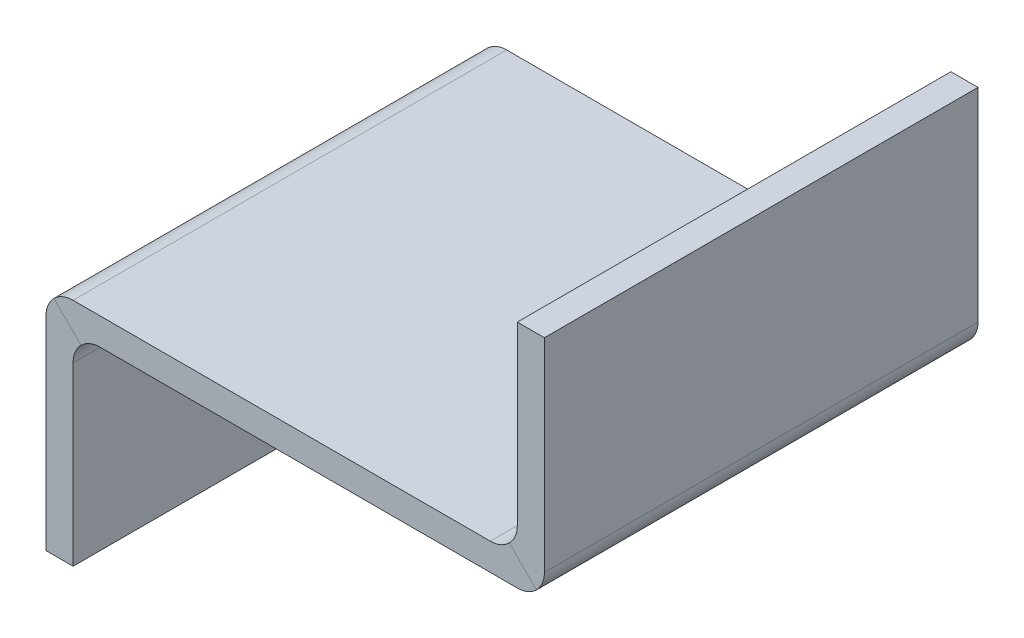
ISO-10303-21;
HEADER;
FILE_DESCRIPTION(('STEP AP214'),'2;1');
FILE_NAME('part.step','',(''),(''),'','','');
FILE_SCHEMA(('AUTOMOTIVE_DESIGN { 1 0 10303 214 1 1 1 1 }'));
ENDSEC;
DATA;
#1=APPLICATION_CONTEXT('core data for automotive mechanical design processes');
#2=APPLICATION_PROTOCOL_DEFINITION('international standard','automotive_design',2000,#1);
#3=PRODUCT_CONTEXT('',#1,'mechanical');
#4=PRODUCT('Part','Part','',(#3));
#5=PRODUCT_RELATED_PRODUCT_CATEGORY('part','',(#4));
#6=PRODUCT_DEFINITION_FORMATION('','',#4);
#7=PRODUCT_DEFINITION_CONTEXT('part definition',#1,'design');
#8=PRODUCT_DEFINITION('design','',#6,#7);
#9=PRODUCT_DEFINITION_SHAPE('','',#8);
#10=(LENGTH_UNIT() NAMED_UNIT(*) SI_UNIT(.MILLI.,.METRE.));
#11=(NAMED_UNIT(*) PLANE_ANGLE_UNIT() SI_UNIT($,.RADIAN.));
#12=(NAMED_UNIT(*) SI_UNIT($,.STERADIAN.) SOLID_ANGLE_UNIT());
#13=UNCERTAINTY_MEASURE_WITH_UNIT(LENGTH_MEASURE(1.E-05),#10,'distance_accuracy_value','');
#14=(GEOMETRIC_REPRESENTATION_CONTEXT(3) GLOBAL_UNCERTAINTY_ASSIGNED_CONTEXT((#13)) GLOBAL_UNIT_ASSIGNED_CONTEXT((#10,
#11,#12)) REPRESENTATION_CONTEXT('',''));
#15=CARTESIAN_POINT('',(0.,0.,0.));
#16=DIRECTION('',(0.,0.,1.));
#17=DIRECTION('',(1.,0.,0.));
#18=AXIS2_PLACEMENT_3D('',#15,#16,#17);
#19=CARTESIAN_POINT('',(21.74,20.,0.));
#20=DIRECTION('',(0.,-1.,0.));
#21=DIRECTION('',(0.,0.,1.));
#22=AXIS2_PLACEMENT_3D('',#19,#20,#21);
#23=PLANE('',#22);
#24=DIRECTION('',(-1.,0.,0.));
#25=VECTOR('',#24,1.);
#26=CARTESIAN_POINT('',(22.99,20.,-20.0000000000008));
#27=LINE('',#26,#25);
#28=CARTESIAN_POINT('',(22.99,20.,-20.0000000000008));
#29=VERTEX_POINT('',#28);
#30=CARTESIAN_POINT('',(20.49,20.,-20.0000000000008));
#31=VERTEX_POINT('',#30);
#32=EDGE_CURVE('E229',#29,#31,#27,.T.);
#33=ORIENTED_EDGE('',*,*,#32,.T.);
#34=DIRECTION('',(0.,0.,1.));
#35=VECTOR('',#34,1.);
#36=CARTESIAN_POINT('',(20.49,20.,20.));
#37=LINE('',#36,#35);
#38=CARTESIAN_POINT('',(20.49,20.,20.));
#39=VERTEX_POINT('',#38);
#40=EDGE_CURVE('E225',#31,#39,#37,.T.);
#41=ORIENTED_EDGE('',*,*,#40,.T.);
#42=DIRECTION('',(1.,0.,0.));
#43=VECTOR('',#42,1.);
#44=CARTESIAN_POINT('',(22.99,20.,20.));
#45=LINE('',#44,#43);
#46=CARTESIAN_POINT('',(22.99,20.,20.));
#47=VERTEX_POINT('',#46);
#48=EDGE_CURVE('E221',#39,#47,#45,.T.);
#49=ORIENTED_EDGE('',*,*,#48,.T.);
#50=DIRECTION('',(0.,0.,-1.));
#51=VECTOR('',#50,1.);
#52=CARTESIAN_POINT('',(22.99,20.,20.));
#53=LINE('',#52,#51);
#54=EDGE_CURVE('E217',#47,#29,#53,.T.);
#55=ORIENTED_EDGE('',*,*,#54,.T.);
#56=EDGE_LOOP('',(#33,#41,#49,#55));
#57=FACE_BOUND('',#56,.T.);
#58=ADVANCED_FACE('F39',(#57),#23,.F.);
#59=CARTESIAN_POINT('',(-21.74,-20.,0.));
#60=DIRECTION('',(0.,-1.,0.));
#61=DIRECTION('',(0.,0.,1.));
#62=AXIS2_PLACEMENT_3D('',#59,#60,#61);
#63=PLANE('',#62);
#64=DIRECTION('',(-1.,0.,0.));
#65=VECTOR('',#64,1.);
#66=CARTESIAN_POINT('',(-20.49,-20.,-20.0000000000008));
#67=LINE('',#66,#65);
#68=CARTESIAN_POINT('',(-20.49,-20.,-20.0000000000008));
#69=VERTEX_POINT('',#68);
#70=CARTESIAN_POINT('',(-22.99,-20.,-20.0000000000008));
#71=VERTEX_POINT('',#70);
#72=EDGE_CURVE('E151',#69,#71,#67,.T.);
#73=ORIENTED_EDGE('',*,*,#72,.F.);
#74=DIRECTION('',(0.,0.,-1.));
#75=VECTOR('',#74,1.);
#76=CARTESIAN_POINT('',(-20.49,-20.,20.));
#77=LINE('',#76,#75);
#78=CARTESIAN_POINT('',(-20.49,-20.,20.));
#79=VERTEX_POINT('',#78);
#80=EDGE_CURVE('E154',#79,#69,#77,.T.);
#81=ORIENTED_EDGE('',*,*,#80,.F.);
#82=DIRECTION('',(1.,0.,0.));
#83=VECTOR('',#82,1.);
#84=CARTESIAN_POINT('',(-20.49,-20.,20.));
#85=LINE('',#84,#83);
#86=CARTESIAN_POINT('',(-22.99,-20.,20.));
#87=VERTEX_POINT('',#86);
#88=EDGE_CURVE('E174',#87,#79,#85,.T.);
#89=ORIENTED_EDGE('',*,*,#88,.F.);
#90=DIRECTION('',(0.,0.,1.));
#91=VECTOR('',#90,1.);
#92=CARTESIAN_POINT('',(-22.99,-20.,20.));
#93=LINE('',#92,#91);
#94=EDGE_CURVE('E157',#71,#87,#93,.T.);
#95=ORIENTED_EDGE('',*,*,#94,.F.);
#96=EDGE_LOOP('',(#73,#81,#89,#95));
#97=FACE_BOUND('',#96,.T.);
#98=ADVANCED_FACE('F153',(#97),#63,.T.);
#99=CARTESIAN_POINT('',(22.99,-1.47500000000004,-20.0000000000008));
#100=DIRECTION('',(0.,0.,-1.));
#101=DIRECTION('',(-1.,0.,0.));
#102=AXIS2_PLACEMENT_3D('',#99,#100,#101);
#103=PLANE('',#102);
#104=DIRECTION('',(0.,1.,0.));
#105=VECTOR('',#104,1.);
#106=CARTESIAN_POINT('',(22.99,-1.47500000000004,-20.0000000000008));
#107=LINE('',#106,#105);
#108=CARTESIAN_POINT('',(22.99,1.25000000000003,-20.0000000000008));
#109=VERTEX_POINT('',#108);
#110=EDGE_CURVE('E203',#109,#29,#107,.T.);
#111=ORIENTED_EDGE('',*,*,#110,.F.);
#112=CARTESIAN_POINT('',(20.49,1.25000000000003,-20.0000000000008));
#113=DIRECTION('',(0.,0.,-1.));
#114=DIRECTION('',(-1.,0.,0.));
#115=AXIS2_PLACEMENT_3D('',#112,#113,#114);
#116=CIRCLE('',#115,2.5);
#117=CARTESIAN_POINT('',(22.2577669529664,-0.517766952966372,-20.0000000000008));
#118=VERTEX_POINT('',#117);
#119=EDGE_CURVE('E276',#109,#118,#116,.T.);
#120=ORIENTED_EDGE('',*,*,#119,.T.);
#121=DIRECTION('',(0.707106781186547,-0.707106781186548,0.));
#122=VECTOR('',#121,1.);
#123=CARTESIAN_POINT('',(-0.112499999999981,21.8525,-20.0000000000008));
#124=LINE('',#123,#122);
#125=CARTESIAN_POINT('',(19.7577669529663,1.98223304703368,-20.0000000000008));
#126=VERTEX_POINT('',#125);
#127=EDGE_CURVE('E198',#126,#118,#124,.T.);
#128=ORIENTED_EDGE('',*,*,#127,.F.);
#129=CARTESIAN_POINT('',(17.99,3.75000000000007,-20.0000000000008));
#130=DIRECTION('',(0.,0.,-1.));
#131=DIRECTION('',(-1.,0.,0.));
#132=AXIS2_PLACEMENT_3D('',#129,#130,#131);
#133=CIRCLE('',#132,2.5);
#134=CARTESIAN_POINT('',(20.49,3.75000000000007,-20.0000000000008));
#135=VERTEX_POINT('',#134);
#136=EDGE_CURVE('E300',#126,#135,#133,.F.);
#137=ORIENTED_EDGE('',*,*,#136,.T.);
#138=DIRECTION('',(0.,1.,0.));
#139=VECTOR('',#138,1.);
#140=CARTESIAN_POINT('',(20.49,-1.47500000000004,-20.0000000000008));
#141=LINE('',#140,#139);
#142=EDGE_CURVE('E239',#135,#31,#141,.T.);
#143=ORIENTED_EDGE('',*,*,#142,.T.);
#144=ORIENTED_EDGE('',*,*,#32,.F.);
#145=EDGE_LOOP('',(#111,#120,#128,#137,#143,#144));
#146=FACE_BOUND('',#145,.T.);
#147=ADVANCED_FACE('F369',(#146),#103,.T.);
#148=CARTESIAN_POINT('',(20.49,-1.47500000000004,20.));
#149=DIRECTION('',(-1.,0.,0.));
#150=DIRECTION('',(0.,-1.,0.));
#151=AXIS2_PLACEMENT_3D('',#148,#149,#150);
#152=PLANE('',#151);
#153=ORIENTED_EDGE('',*,*,#142,.F.);
#154=DIRECTION('',(0.,0.,-1.));
#155=VECTOR('',#154,1.);
#156=CARTESIAN_POINT('',(20.49,3.75000000000007,20.));
#157=LINE('',#156,#155);
#158=CARTESIAN_POINT('',(20.49,3.75000000000007,20.));
#159=VERTEX_POINT('',#158);
#160=EDGE_CURVE('E287',#135,#159,#157,.F.);
#161=ORIENTED_EDGE('',*,*,#160,.T.);
#162=DIRECTION('',(0.,1.,0.));
#163=VECTOR('',#162,1.);
#164=CARTESIAN_POINT('',(20.49,-1.47500000000004,20.));
#165=LINE('',#164,#163);
#166=EDGE_CURVE('E236',#159,#39,#165,.T.);
#167=ORIENTED_EDGE('',*,*,#166,.T.);
#168=ORIENTED_EDGE('',*,*,#40,.F.);
#169=EDGE_LOOP('',(#153,#161,#167,#168));
#170=FACE_BOUND('',#169,.T.);
#171=ADVANCED_FACE('F375',(#170),#152,.T.);
#172=CARTESIAN_POINT('',(22.99,-1.47500000000004,20.));
#173=DIRECTION('',(0.,0.,1.));
#174=DIRECTION('',(1.,0.,0.));
#175=AXIS2_PLACEMENT_3D('',#172,#173,#174);
#176=PLANE('',#175);
#177=DIRECTION('',(-0.707106781186547,0.707106781186548,0.));
#178=VECTOR('',#177,1.);
#179=CARTESIAN_POINT('',(-0.112499999999981,21.8525,20.));
#180=LINE('',#179,#178);
#181=CARTESIAN_POINT('',(22.2577669529664,-0.517766952966372,20.));
#182=VERTEX_POINT('',#181);
#183=CARTESIAN_POINT('',(19.7577669529663,1.98223304703368,20.));
#184=VERTEX_POINT('',#183);
#185=EDGE_CURVE('E162',#182,#184,#180,.T.);
#186=ORIENTED_EDGE('',*,*,#185,.F.);
#187=CARTESIAN_POINT('',(20.49,1.25000000000003,20.));
#188=DIRECTION('',(0.,0.,1.));
#189=DIRECTION('',(1.,0.,0.));
#190=AXIS2_PLACEMENT_3D('',#187,#188,#189);
#191=CIRCLE('',#190,2.5);
#192=CARTESIAN_POINT('',(22.99,1.25000000000003,20.));
#193=VERTEX_POINT('',#192);
#194=EDGE_CURVE('E270',#182,#193,#191,.T.);
#195=ORIENTED_EDGE('',*,*,#194,.T.);
#196=DIRECTION('',(0.,1.,0.));
#197=VECTOR('',#196,1.);
#198=CARTESIAN_POINT('',(22.99,-1.47500000000004,20.));
#199=LINE('',#198,#197);
#200=EDGE_CURVE('E233',#193,#47,#199,.T.);
#201=ORIENTED_EDGE('',*,*,#200,.T.);
#202=ORIENTED_EDGE('',*,*,#48,.F.);
#203=ORIENTED_EDGE('',*,*,#166,.F.);
#204=CARTESIAN_POINT('',(17.99,3.75000000000007,20.));
#205=DIRECTION('',(0.,0.,1.));
#206=DIRECTION('',(1.,0.,0.));
#207=AXIS2_PLACEMENT_3D('',#204,#205,#206);
#208=CIRCLE('',#207,2.5);
#209=EDGE_CURVE('E303',#159,#184,#208,.F.);
#210=ORIENTED_EDGE('',*,*,#209,.T.);
#211=EDGE_LOOP('',(#186,#195,#201,#202,#203,#210));
#212=FACE_BOUND('',#211,.T.);
#213=ADVANCED_FACE('F361',(#212),#176,.T.);
#214=CARTESIAN_POINT('',(22.99,-1.47500000000004,20.));
#215=DIRECTION('',(1.,0.,0.));
#216=DIRECTION('',(0.,1.,0.));
#217=AXIS2_PLACEMENT_3D('',#214,#215,#216);
#218=PLANE('',#217);
#219=ORIENTED_EDGE('',*,*,#200,.F.);
#220=DIRECTION('',(0.,0.,1.));
#221=VECTOR('',#220,1.);
#222=CARTESIAN_POINT('',(22.99,1.25000000000003,20.));
#223=LINE('',#222,#221);
#224=EDGE_CURVE('E273',#193,#109,#223,.F.);
#225=ORIENTED_EDGE('',*,*,#224,.T.);
#226=ORIENTED_EDGE('',*,*,#110,.T.);
#227=ORIENTED_EDGE('',*,*,#54,.F.);
#228=EDGE_LOOP('',(#219,#225,#226,#227));
#229=FACE_BOUND('',#228,.T.);
#230=ADVANCED_FACE('F366',(#229),#218,.T.);
#231=CARTESIAN_POINT('',(-23.215,-1.25000000000003,20.));
#232=DIRECTION('',(0.,-1.,0.));
#233=DIRECTION('',(1.,0.,0.));
#234=AXIS2_PLACEMENT_3D('',#231,#232,#233);
#235=PLANE('',#234);
#236=DIRECTION('',(1.,0.,0.));
#237=VECTOR('',#236,1.);
#238=CARTESIAN_POINT('',(-23.215,-1.25000000000003,20.));
#239=LINE('',#238,#237);
#240=CARTESIAN_POINT('',(-17.99,-1.25000000000002,20.));
#241=VERTEX_POINT('',#240);
#242=CARTESIAN_POINT('',(20.49,-1.24999999999997,20.));
#243=VERTEX_POINT('',#242);
#244=EDGE_CURVE('E199',#241,#243,#239,.T.);
#245=ORIENTED_EDGE('',*,*,#244,.F.);
#246=DIRECTION('',(0.,0.,1.));
#247=VECTOR('',#246,1.);
#248=CARTESIAN_POINT('',(-17.99,-1.25000000000002,-20.0000000000008));
#249=LINE('',#248,#247);
#250=CARTESIAN_POINT('',(-17.99,-1.25000000000002,-20.0000000000008));
#251=VERTEX_POINT('',#250);
#252=EDGE_CURVE('E293',#241,#251,#249,.F.);
#253=ORIENTED_EDGE('',*,*,#252,.T.);
#254=DIRECTION('',(1.,0.,0.));
#255=VECTOR('',#254,1.);
#256=CARTESIAN_POINT('',(-23.215,-1.25000000000003,-20.0000000000008));
#257=LINE('',#256,#255);
#258=CARTESIAN_POINT('',(20.49,-1.24999999999997,-20.0000000000008));
#259=VERTEX_POINT('',#258);
#260=EDGE_CURVE('E211',#251,#259,#257,.T.);
#261=ORIENTED_EDGE('',*,*,#260,.T.);
#262=DIRECTION('',(0.,0.,1.));
#263=VECTOR('',#262,1.);
#264=CARTESIAN_POINT('',(20.49,-1.24999999999997,20.));
#265=LINE('',#264,#263);
#266=EDGE_CURVE('E263',#259,#243,#265,.T.);
#267=ORIENTED_EDGE('',*,*,#266,.T.);
#268=EDGE_LOOP('',(#245,#253,#261,#267));
#269=FACE_BOUND('',#268,.T.);
#270=ADVANCED_FACE('F357',(#269),#235,.T.);
#271=CARTESIAN_POINT('',(-23.215,-1.25000000000003,20.));
#272=DIRECTION('',(0.,0.,1.));
#273=DIRECTION('',(1.,0.,0.));
#274=AXIS2_PLACEMENT_3D('',#271,#272,#273);
#275=PLANE('',#274);
#276=DIRECTION('',(-0.707106781186548,0.707106781186547,0.));
#277=VECTOR('',#276,1.);
#278=CARTESIAN_POINT('',(-11.115,-10.625,20.));
#279=LINE('',#278,#277);
#280=CARTESIAN_POINT('',(-19.7577669529663,-1.98223304703366,20.));
#281=VERTEX_POINT('',#280);
#282=CARTESIAN_POINT('',(-22.2577669529664,0.517766952966387,20.));
#283=VERTEX_POINT('',#282);
#284=EDGE_CURVE('E62',#281,#283,#279,.T.);
#285=ORIENTED_EDGE('',*,*,#284,.F.);
#286=CARTESIAN_POINT('',(-17.99,-3.75000000000002,20.));
#287=DIRECTION('',(0.,0.,1.));
#288=DIRECTION('',(1.,0.,0.));
#289=AXIS2_PLACEMENT_3D('',#286,#287,#288);
#290=CIRCLE('',#289,2.5);
#291=EDGE_CURVE('E313',#281,#241,#290,.F.);
#292=ORIENTED_EDGE('',*,*,#291,.T.);
#293=ORIENTED_EDGE('',*,*,#244,.T.);
#294=CARTESIAN_POINT('',(20.49,1.25000000000003,20.));
#295=DIRECTION('',(0.,0.,1.));
#296=DIRECTION('',(1.,0.,0.));
#297=AXIS2_PLACEMENT_3D('',#294,#295,#296);
#298=CIRCLE('',#297,2.5);
#299=EDGE_CURVE('E267',#243,#182,#298,.T.);
#300=ORIENTED_EDGE('',*,*,#299,.T.);
#301=ORIENTED_EDGE('',*,*,#185,.T.);
#302=CARTESIAN_POINT('',(17.99,3.75000000000007,20.));
#303=DIRECTION('',(0.,0.,1.));
#304=DIRECTION('',(1.,0.,0.));
#305=AXIS2_PLACEMENT_3D('',#302,#303,#304);
#306=CIRCLE('',#305,2.5);
#307=CARTESIAN_POINT('',(17.99,1.25000000000007,20.));
#308=VERTEX_POINT('',#307);
#309=EDGE_CURVE('E307',#184,#308,#306,.F.);
#310=ORIENTED_EDGE('',*,*,#309,.T.);
#311=DIRECTION('',(1.,0.,0.));
#312=VECTOR('',#311,1.);
#313=CARTESIAN_POINT('',(-23.215,1.25000000000002,20.));
#314=LINE('',#313,#312);
#315=CARTESIAN_POINT('',(-20.49,1.25000000000002,20.));
#316=VERTEX_POINT('',#315);
#317=EDGE_CURVE('E202',#316,#308,#314,.T.);
#318=ORIENTED_EDGE('',*,*,#317,.F.);
#319=CARTESIAN_POINT('',(-20.49,-1.24999999999998,20.));
#320=DIRECTION('',(0.,0.,1.));
#321=DIRECTION('',(1.,0.,0.));
#322=AXIS2_PLACEMENT_3D('',#319,#320,#321);
#323=CIRCLE('',#322,2.5);
#324=EDGE_CURVE('E257',#316,#283,#323,.T.);
#325=ORIENTED_EDGE('',*,*,#324,.T.);
#326=EDGE_LOOP('',(#285,#292,#293,#300,#301,#310,#318,#325));
#327=FACE_BOUND('',#326,.T.);
#328=ADVANCED_FACE('F358',(#327),#275,.T.);
#329=CARTESIAN_POINT('',(-23.215,1.25000000000002,20.));
#330=DIRECTION('',(0.,1.,0.));
#331=DIRECTION('',(-1.,0.,0.));
#332=AXIS2_PLACEMENT_3D('',#329,#330,#331);
#333=PLANE('',#332);
#334=ORIENTED_EDGE('',*,*,#317,.T.);
#335=DIRECTION('',(0.,0.,-1.));
#336=VECTOR('',#335,1.);
#337=CARTESIAN_POINT('',(17.99,1.25000000000007,-20.0000000000008));
#338=LINE('',#337,#336);
#339=CARTESIAN_POINT('',(17.99,1.25000000000007,-20.0000000000008));
#340=VERTEX_POINT('',#339);
#341=EDGE_CURVE('E283',#308,#340,#338,.T.);
#342=ORIENTED_EDGE('',*,*,#341,.T.);
#343=DIRECTION('',(1.,0.,0.));
#344=VECTOR('',#343,1.);
#345=CARTESIAN_POINT('',(-23.215,1.25000000000002,-20.0000000000008));
#346=LINE('',#345,#344);
#347=CARTESIAN_POINT('',(-20.49,1.25000000000002,-20.0000000000008));
#348=VERTEX_POINT('',#347);
#349=EDGE_CURVE('E207',#348,#340,#346,.T.);
#350=ORIENTED_EDGE('',*,*,#349,.F.);
#351=DIRECTION('',(0.,0.,-1.));
#352=VECTOR('',#351,1.);
#353=CARTESIAN_POINT('',(-20.49,1.25000000000002,20.));
#354=LINE('',#353,#352);
#355=EDGE_CURVE('E254',#348,#316,#354,.F.);
#356=ORIENTED_EDGE('',*,*,#355,.T.);
#357=EDGE_LOOP('',(#334,#342,#350,#356));
#358=FACE_BOUND('',#357,.T.);
#359=ADVANCED_FACE('F337',(#358),#333,.T.);
#360=CARTESIAN_POINT('',(-23.215,-1.25000000000003,-20.0000000000008));
#361=DIRECTION('',(0.,0.,-1.));
#362=DIRECTION('',(-1.,0.,0.));
#363=AXIS2_PLACEMENT_3D('',#360,#361,#362);
#364=PLANE('',#363);
#365=ORIENTED_EDGE('',*,*,#127,.T.);
#366=CARTESIAN_POINT('',(20.49,1.25000000000003,-20.0000000000008));
#367=DIRECTION('',(0.,0.,-1.));
#368=DIRECTION('',(-1.,0.,0.));
#369=AXIS2_PLACEMENT_3D('',#366,#367,#368);
#370=CIRCLE('',#369,2.5);
#371=EDGE_CURVE('E279',#118,#259,#370,.T.);
#372=ORIENTED_EDGE('',*,*,#371,.T.);
#373=ORIENTED_EDGE('',*,*,#260,.F.);
#374=CARTESIAN_POINT('',(-17.99,-3.75000000000002,-20.0000000000008));
#375=DIRECTION('',(0.,0.,-1.));
#376=DIRECTION('',(-1.,0.,0.));
#377=AXIS2_PLACEMENT_3D('',#374,#375,#376);
#378=CIRCLE('',#377,2.5);
#379=CARTESIAN_POINT('',(-19.7577669529663,-1.98223304703366,-20.0000000000008));
#380=VERTEX_POINT('',#379);
#381=EDGE_CURVE('E48',#251,#380,#378,.F.);
#382=ORIENTED_EDGE('',*,*,#381,.T.);
#383=DIRECTION('',(0.707106781186548,-0.707106781186547,0.));
#384=VECTOR('',#383,1.);
#385=CARTESIAN_POINT('',(-11.115,-10.625,-20.0000000000008));
#386=LINE('',#385,#384);
#387=CARTESIAN_POINT('',(-22.2577669529664,0.517766952966387,-20.0000000000008));
#388=VERTEX_POINT('',#387);
#389=EDGE_CURVE('E54',#388,#380,#386,.T.);
#390=ORIENTED_EDGE('',*,*,#389,.F.);
#391=CARTESIAN_POINT('',(-20.49,-1.24999999999998,-20.0000000000008));
#392=DIRECTION('',(0.,0.,-1.));
#393=DIRECTION('',(-1.,0.,0.));
#394=AXIS2_PLACEMENT_3D('',#391,#392,#393);
#395=CIRCLE('',#394,2.5);
#396=EDGE_CURVE('E251',#388,#348,#395,.T.);
#397=ORIENTED_EDGE('',*,*,#396,.T.);
#398=ORIENTED_EDGE('',*,*,#349,.T.);
#399=CARTESIAN_POINT('',(17.99,3.75000000000007,-20.0000000000008));
#400=DIRECTION('',(0.,0.,-1.));
#401=DIRECTION('',(-1.,0.,0.));
#402=AXIS2_PLACEMENT_3D('',#399,#400,#401);
#403=CIRCLE('',#402,2.5);
#404=EDGE_CURVE('E296',#340,#126,#403,.F.);
#405=ORIENTED_EDGE('',*,*,#404,.T.);
#406=EDGE_LOOP('',(#365,#372,#373,#382,#390,#397,#398,#405));
#407=FACE_BOUND('',#406,.T.);
#408=ADVANCED_FACE('F319',(#407),#364,.T.);
#409=CARTESIAN_POINT('',(-20.49,-20.,20.));
#410=DIRECTION('',(1.,0.,0.));
#411=DIRECTION('',(0.,1.,0.));
#412=AXIS2_PLACEMENT_3D('',#409,#410,#411);
#413=PLANE('',#412);
#414=DIRECTION('',(0.,1.,0.));
#415=VECTOR('',#414,1.);
#416=CARTESIAN_POINT('',(-20.49,-20.,-20.0000000000008));
#417=LINE('',#416,#415);
#418=CARTESIAN_POINT('',(-20.49,-3.75000000000002,-20.0000000000008));
#419=VERTEX_POINT('',#418);
#420=EDGE_CURVE('E169',#69,#419,#417,.T.);
#421=ORIENTED_EDGE('',*,*,#420,.T.);
#422=DIRECTION('',(0.,0.,1.));
#423=VECTOR('',#422,1.);
#424=CARTESIAN_POINT('',(-20.49,-3.75000000000002,20.));
#425=LINE('',#424,#423);
#426=CARTESIAN_POINT('',(-20.49,-3.75000000000002,20.));
#427=VERTEX_POINT('',#426);
#428=EDGE_CURVE('E290',#419,#427,#425,.T.);
#429=ORIENTED_EDGE('',*,*,#428,.T.);
#430=DIRECTION('',(0.,1.,0.));
#431=VECTOR('',#430,1.);
#432=CARTESIAN_POINT('',(-20.49,-20.,20.));
#433=LINE('',#432,#431);
#434=EDGE_CURVE('E172',#79,#427,#433,.T.);
#435=ORIENTED_EDGE('',*,*,#434,.F.);
#436=ORIENTED_EDGE('',*,*,#80,.T.);
#437=EDGE_LOOP('',(#421,#429,#435,#436));
#438=FACE_BOUND('',#437,.T.);
#439=ADVANCED_FACE('F167',(#438),#413,.T.);
#440=CARTESIAN_POINT('',(-20.49,-20.,20.));
#441=DIRECTION('',(0.,0.,1.));
#442=DIRECTION('',(1.,0.,0.));
#443=AXIS2_PLACEMENT_3D('',#440,#441,#442);
#444=PLANE('',#443);
#445=ORIENTED_EDGE('',*,*,#284,.T.);
#446=CARTESIAN_POINT('',(-20.49,-1.24999999999998,20.));
#447=DIRECTION('',(0.,0.,1.));
#448=DIRECTION('',(1.,0.,0.));
#449=AXIS2_PLACEMENT_3D('',#446,#447,#448);
#450=CIRCLE('',#449,2.5);
#451=CARTESIAN_POINT('',(-22.99,-1.24999999999998,20.));
#452=VERTEX_POINT('',#451);
#453=EDGE_CURVE('E260',#283,#452,#450,.T.);
#454=ORIENTED_EDGE('',*,*,#453,.T.);
#455=DIRECTION('',(0.,1.,0.));
#456=VECTOR('',#455,1.);
#457=CARTESIAN_POINT('',(-22.99,-20.,20.));
#458=LINE('',#457,#456);
#459=EDGE_CURVE('E182',#87,#452,#458,.T.);
#460=ORIENTED_EDGE('',*,*,#459,.F.);
#461=ORIENTED_EDGE('',*,*,#88,.T.);
#462=ORIENTED_EDGE('',*,*,#434,.T.);
#463=CARTESIAN_POINT('',(-17.99,-3.75000000000002,20.));
#464=DIRECTION('',(0.,0.,1.));
#465=DIRECTION('',(1.,0.,0.));
#466=AXIS2_PLACEMENT_3D('',#463,#464,#465);
#467=CIRCLE('',#466,2.5);
#468=EDGE_CURVE('E310',#427,#281,#467,.F.);
#469=ORIENTED_EDGE('',*,*,#468,.T.);
#470=EDGE_LOOP('',(#445,#454,#460,#461,#462,#469));
#471=FACE_BOUND('',#470,.T.);
#472=ADVANCED_FACE('F325',(#471),#444,.T.);
#473=CARTESIAN_POINT('',(-22.99,-20.,20.));
#474=DIRECTION('',(-1.,0.,0.));
#475=DIRECTION('',(0.,-1.,0.));
#476=AXIS2_PLACEMENT_3D('',#473,#474,#475);
#477=PLANE('',#476);
#478=ORIENTED_EDGE('',*,*,#459,.T.);
#479=DIRECTION('',(0.,0.,-1.));
#480=VECTOR('',#479,1.);
#481=CARTESIAN_POINT('',(-22.99,-1.24999999999998,20.));
#482=LINE('',#481,#480);
#483=CARTESIAN_POINT('',(-22.99,-1.24999999999998,-20.0000000000008));
#484=VERTEX_POINT('',#483);
#485=EDGE_CURVE('E244',#452,#484,#482,.T.);
#486=ORIENTED_EDGE('',*,*,#485,.T.);
#487=DIRECTION('',(0.,1.,0.));
#488=VECTOR('',#487,1.);
#489=CARTESIAN_POINT('',(-22.99,-20.,-20.0000000000008));
#490=LINE('',#489,#488);
#491=EDGE_CURVE('E179',#71,#484,#490,.T.);
#492=ORIENTED_EDGE('',*,*,#491,.F.);
#493=ORIENTED_EDGE('',*,*,#94,.T.);
#494=EDGE_LOOP('',(#478,#486,#492,#493));
#495=FACE_BOUND('',#494,.T.);
#496=ADVANCED_FACE('F328',(#495),#477,.T.);
#497=CARTESIAN_POINT('',(-20.49,-20.,-20.0000000000008));
#498=DIRECTION('',(0.,0.,-1.));
#499=DIRECTION('',(-1.,0.,0.));
#500=AXIS2_PLACEMENT_3D('',#497,#498,#499);
#501=PLANE('',#500);
#502=ORIENTED_EDGE('',*,*,#491,.T.);
#503=CARTESIAN_POINT('',(-20.49,-1.24999999999998,-20.0000000000008));
#504=DIRECTION('',(0.,0.,-1.));
#505=DIRECTION('',(-1.,0.,0.));
#506=AXIS2_PLACEMENT_3D('',#503,#504,#505);
#507=CIRCLE('',#506,2.5);
#508=EDGE_CURVE('E248',#484,#388,#507,.T.);
#509=ORIENTED_EDGE('',*,*,#508,.T.);
#510=ORIENTED_EDGE('',*,*,#389,.T.);
#511=CARTESIAN_POINT('',(-17.99,-3.75000000000002,-20.0000000000008));
#512=DIRECTION('',(0.,0.,-1.));
#513=DIRECTION('',(-1.,0.,0.));
#514=AXIS2_PLACEMENT_3D('',#511,#512,#513);
#515=CIRCLE('',#514,2.5);
#516=EDGE_CURVE('E11',#380,#419,#515,.F.);
#517=ORIENTED_EDGE('',*,*,#516,.T.);
#518=ORIENTED_EDGE('',*,*,#420,.F.);
#519=ORIENTED_EDGE('',*,*,#72,.T.);
#520=EDGE_LOOP('',(#502,#509,#510,#517,#518,#519));
#521=FACE_BOUND('',#520,.T.);
#522=ADVANCED_FACE('F176',(#521),#501,.T.);
#523=CARTESIAN_POINT('',(-20.49,-1.24999999999998,20.));
#524=DIRECTION('',(0.,0.,-1.));
#525=DIRECTION('',(-1.,0.,0.));
#526=AXIS2_PLACEMENT_3D('',#523,#524,#525);
#527=CYLINDRICAL_SURFACE('',#526,2.5);
#528=ORIENTED_EDGE('',*,*,#324,.F.);
#529=ORIENTED_EDGE('',*,*,#355,.F.);
#530=ORIENTED_EDGE('',*,*,#396,.F.);
#531=ORIENTED_EDGE('',*,*,#508,.F.);
#532=ORIENTED_EDGE('',*,*,#485,.F.);
#533=ORIENTED_EDGE('',*,*,#453,.F.);
#534=EDGE_LOOP('',(#528,#529,#530,#531,#532,#533));
#535=FACE_BOUND('',#534,.T.);
#536=ADVANCED_FACE('F332',(#535),#527,.T.);
#537=CARTESIAN_POINT('',(20.49,1.25000000000003,20.));
#538=DIRECTION('',(0.,0.,1.));
#539=DIRECTION('',(1.,0.,0.));
#540=AXIS2_PLACEMENT_3D('',#537,#538,#539);
#541=CYLINDRICAL_SURFACE('',#540,2.5);
#542=ORIENTED_EDGE('',*,*,#119,.F.);
#543=ORIENTED_EDGE('',*,*,#224,.F.);
#544=ORIENTED_EDGE('',*,*,#194,.F.);
#545=ORIENTED_EDGE('',*,*,#299,.F.);
#546=ORIENTED_EDGE('',*,*,#266,.F.);
#547=ORIENTED_EDGE('',*,*,#371,.F.);
#548=EDGE_LOOP('',(#542,#543,#544,#545,#546,#547));
#549=FACE_BOUND('',#548,.T.);
#550=ADVANCED_FACE('F351',(#549),#541,.T.);
#551=CARTESIAN_POINT('',(17.99,3.75000000000007,20.));
#552=DIRECTION('',(0.,0.,1.));
#553=DIRECTION('',(1.,0.,0.));
#554=AXIS2_PLACEMENT_3D('',#551,#552,#553);
#555=CYLINDRICAL_SURFACE('',#554,2.5);
#556=ORIENTED_EDGE('',*,*,#209,.F.);
#557=ORIENTED_EDGE('',*,*,#160,.F.);
#558=ORIENTED_EDGE('',*,*,#136,.F.);
#559=ORIENTED_EDGE('',*,*,#404,.F.);
#560=ORIENTED_EDGE('',*,*,#341,.F.);
#561=ORIENTED_EDGE('',*,*,#309,.F.);
#562=EDGE_LOOP('',(#556,#557,#558,#559,#560,#561));
#563=FACE_BOUND('',#562,.T.);
#564=ADVANCED_FACE('F343',(#563),#555,.F.);
#565=CARTESIAN_POINT('',(-17.99,-3.75000000000002,20.));
#566=DIRECTION('',(0.,0.,-1.));
#567=DIRECTION('',(-1.,0.,0.));
#568=AXIS2_PLACEMENT_3D('',#565,#566,#567);
#569=CYLINDRICAL_SURFACE('',#568,2.5);
#570=ORIENTED_EDGE('',*,*,#381,.F.);
#571=ORIENTED_EDGE('',*,*,#252,.F.);
#572=ORIENTED_EDGE('',*,*,#291,.F.);
#573=ORIENTED_EDGE('',*,*,#468,.F.);
#574=ORIENTED_EDGE('',*,*,#428,.F.);
#575=ORIENTED_EDGE('',*,*,#516,.F.);
#576=EDGE_LOOP('',(#570,#571,#572,#573,#574,#575));
#577=FACE_BOUND('',#576,.T.);
#578=ADVANCED_FACE('F41',(#577),#569,.F.);
#579=CLOSED_SHELL('',(#58,#98,#147,#171,#213,#230,#270,#328,#359,#408,#439,#472,#496,#522,#536,
#550,#564,#578));
#580=MANIFOLD_SOLID_BREP('B2',#579);
#581=ADVANCED_BREP_SHAPE_REPRESENTATION('',(#18,#580),#14);
#582=SHAPE_DEFINITION_REPRESENTATION(#9,#581);
ENDSEC;
END-ISO-10303-21;
